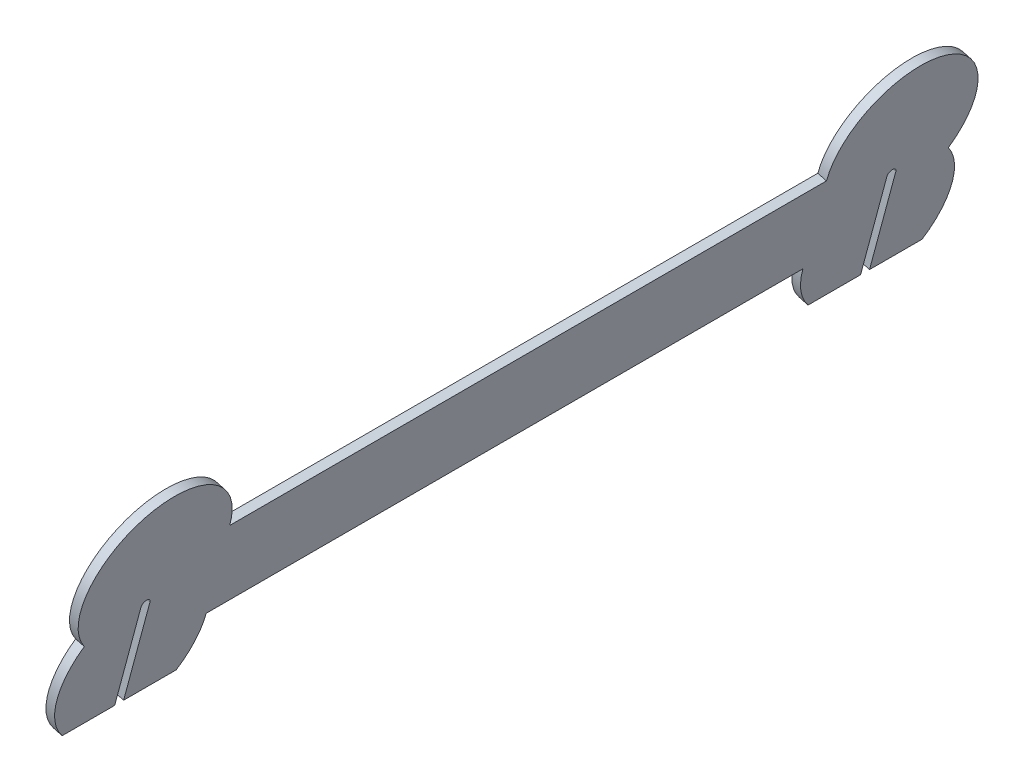
ISO-10303-21;
HEADER;
FILE_DESCRIPTION(('STEP AP214'),'2;1');
FILE_NAME('part.step','',(''),(''),'','','');
FILE_SCHEMA(('AUTOMOTIVE_DESIGN { 1 0 10303 214 1 1 1 1 }'));
ENDSEC;
DATA;
#1=APPLICATION_CONTEXT('core data for automotive mechanical design processes');
#2=APPLICATION_PROTOCOL_DEFINITION('international standard','automotive_design',2000,#1);
#3=PRODUCT_CONTEXT('',#1,'mechanical');
#4=PRODUCT('Part','Part','',(#3));
#5=PRODUCT_RELATED_PRODUCT_CATEGORY('part','',(#4));
#6=PRODUCT_DEFINITION_FORMATION('','',#4);
#7=PRODUCT_DEFINITION_CONTEXT('part definition',#1,'design');
#8=PRODUCT_DEFINITION('design','',#6,#7);
#9=PRODUCT_DEFINITION_SHAPE('','',#8);
#10=(LENGTH_UNIT() NAMED_UNIT(*) SI_UNIT(.MILLI.,.METRE.));
#11=(NAMED_UNIT(*) PLANE_ANGLE_UNIT() SI_UNIT($,.RADIAN.));
#12=(NAMED_UNIT(*) SI_UNIT($,.STERADIAN.) SOLID_ANGLE_UNIT());
#13=UNCERTAINTY_MEASURE_WITH_UNIT(LENGTH_MEASURE(1.E-05),#10,'distance_accuracy_value','');
#14=(GEOMETRIC_REPRESENTATION_CONTEXT(3) GLOBAL_UNCERTAINTY_ASSIGNED_CONTEXT((#13)) GLOBAL_UNIT_ASSIGNED_CONTEXT((#10,
#11,#12)) REPRESENTATION_CONTEXT('',''));
#15=CARTESIAN_POINT('',(0.,0.,0.));
#16=DIRECTION('',(0.,0.,1.));
#17=DIRECTION('',(1.,0.,0.));
#18=AXIS2_PLACEMENT_3D('',#15,#16,#17);
#19=CARTESIAN_POINT('',(228.742174996405,-29.9263928840077,41.2175666415332));
#20=DIRECTION('',(0.258819045102522,0.965925826289068,0.));
#21=DIRECTION('',(-0.965925826289068,0.258819045102523,0.));
#22=AXIS2_PLACEMENT_3D('',#19,#20,#21);
#23=PLANE('',#22);
#24=DIRECTION('',(0.965925826289068,-0.258819045102523,0.));
#25=VECTOR('',#24,1.);
#26=CARTESIAN_POINT('',(228.742174996405,-29.9263928840077,0.));
#27=LINE('',#26,#25);
#28=CARTESIAN_POINT('',(222.94662003867,-28.3734786133926,0.));
#29=VERTEX_POINT('',#28);
#30=CARTESIAN_POINT('',(228.742174996405,-29.9263928840077,0.));
#31=VERTEX_POINT('',#30);
#32=EDGE_CURVE('E155',#29,#31,#27,.T.);
#33=ORIENTED_EDGE('',*,*,#32,.F.);
#34=DIRECTION('',(0.,0.,-1.));
#35=VECTOR('',#34,1.);
#36=CARTESIAN_POINT('',(222.94662003867,-28.3734786133926,41.2175666415332));
#37=LINE('',#36,#35);
#38=CARTESIAN_POINT('',(222.94662003867,-28.3734786133926,-35.2175666415334));
#39=VERTEX_POINT('',#38);
#40=EDGE_CURVE('E72',#29,#39,#37,.T.);
#41=ORIENTED_EDGE('',*,*,#40,.T.);
#42=DIRECTION('',(-0.965925826289068,0.258819045102522,0.));
#43=VECTOR('',#42,1.);
#44=CARTESIAN_POINT('',(228.742174996405,-29.9263928840077,-35.2175666415334));
#45=LINE('',#44,#43);
#46=CARTESIAN_POINT('',(228.742174996405,-29.9263928840077,-35.2175666415334));
#47=VERTEX_POINT('',#46);
#48=EDGE_CURVE('E115',#47,#39,#45,.T.);
#49=ORIENTED_EDGE('',*,*,#48,.F.);
#50=DIRECTION('',(0.,0.,-1.));
#51=VECTOR('',#50,1.);
#52=CARTESIAN_POINT('',(228.742174996405,-29.9263928840077,41.2175666415332));
#53=LINE('',#52,#51);
#54=EDGE_CURVE('E104',#31,#47,#53,.T.);
#55=ORIENTED_EDGE('',*,*,#54,.F.);
#56=EDGE_LOOP('',(#33,#41,#49,#55));
#57=FACE_BOUND('',#56,.T.);
#58=ADVANCED_FACE('F34',(#57),#23,.F.);
#59=CARTESIAN_POINT('',(252.874462761764,60.1365311591842,-246.999999999119));
#60=DIRECTION('',(-0.258819045102522,-0.965925826289068,0.));
#61=DIRECTION('',(0.965925826289068,-0.258819045102523,0.));
#62=AXIS2_PLACEMENT_3D('',#59,#60,#61);
#63=PLANE('',#62);
#64=DIRECTION('',(0.,0.,1.));
#65=VECTOR('',#64,1.);
#66=CARTESIAN_POINT('',(247.078907804029,61.6894454297993,-246.999999999119));
#67=LINE('',#66,#65);
#68=CARTESIAN_POINT('',(247.078907804029,61.6894454297995,-446.999999998238));
#69=VERTEX_POINT('',#68);
#70=CARTESIAN_POINT('',(247.078907804029,61.6894454297993,-47.));
#71=VERTEX_POINT('',#70);
#72=EDGE_CURVE('E128',#69,#71,#67,.T.);
#73=ORIENTED_EDGE('',*,*,#72,.T.);
#74=DIRECTION('',(-0.965925826289068,0.258819045102522,0.));
#75=VECTOR('',#74,1.);
#76=CARTESIAN_POINT('',(252.874462761764,60.1365311591841,-47.));
#77=LINE('',#76,#75);
#78=CARTESIAN_POINT('',(252.874462761764,60.1365311591841,-47.));
#79=VERTEX_POINT('',#78);
#80=EDGE_CURVE('E145',#79,#71,#77,.T.);
#81=ORIENTED_EDGE('',*,*,#80,.F.);
#82=DIRECTION('',(0.,0.,1.));
#83=VECTOR('',#82,1.);
#84=CARTESIAN_POINT('',(252.874462761764,60.1365311591842,-246.999999999119));
#85=LINE('',#84,#83);
#86=CARTESIAN_POINT('',(252.874462761764,60.1365311591843,-446.999999998238));
#87=VERTEX_POINT('',#86);
#88=EDGE_CURVE('E141',#87,#79,#85,.T.);
#89=ORIENTED_EDGE('',*,*,#88,.F.);
#90=DIRECTION('',(-0.965925826289068,0.258819045102522,0.));
#91=VECTOR('',#90,1.);
#92=CARTESIAN_POINT('',(252.874462761764,60.1365311591843,-446.999999998238));
#93=LINE('',#92,#91);
#94=EDGE_CURVE('E205',#87,#69,#93,.T.);
#95=ORIENTED_EDGE('',*,*,#94,.T.);
#96=EDGE_LOOP('',(#73,#81,#89,#95));
#97=FACE_BOUND('',#96,.T.);
#98=ADVANCED_FACE('F36',(#97),#63,.F.);
#99=CARTESIAN_POINT('',(252.874462761764,60.1365311591848,3.));
#100=DIRECTION('',(-0.965925826289068,0.258819045102522,0.));
#101=DIRECTION('',(-0.258819045102523,-0.965925826289068,0.));
#102=AXIS2_PLACEMENT_3D('',#99,#100,#101);
#103=CYLINDRICAL_SURFACE('',#102,50.);
#104=CARTESIAN_POINT('',(247.078907804029,61.6894454298,3.));
#105=DIRECTION('',(0.965925826289068,-0.258819045102522,0.));
#106=DIRECTION('',(0.258819045102522,0.965925826289068,0.));
#107=AXIS2_PLACEMENT_3D('',#104,#105,#106);
#108=CIRCLE('',#107,50.);
#109=CARTESIAN_POINT('',(239.184926928402,32.2287077279829,42.6200706713147));
#110=VERTEX_POINT('',#109);
#111=EDGE_CURVE('E131',#71,#110,#108,.T.);
#112=ORIENTED_EDGE('',*,*,#111,.T.);
#113=DIRECTION('',(-0.965925826289068,0.258819045102522,0.));
#114=VECTOR('',#113,1.);
#115=CARTESIAN_POINT('',(244.980481886137,30.6757934573678,42.6200706713147));
#116=LINE('',#115,#114);
#117=CARTESIAN_POINT('',(244.980481886137,30.6757934573678,42.6200706713147));
#118=VERTEX_POINT('',#117);
#119=EDGE_CURVE('E114',#118,#110,#116,.T.);
#120=ORIENTED_EDGE('',*,*,#119,.F.);
#121=CARTESIAN_POINT('',(252.874462761764,60.1365311591848,3.));
#122=DIRECTION('',(0.965925826289068,-0.258819045102522,0.));
#123=DIRECTION('',(0.258819045102522,0.965925826289068,0.));
#124=AXIS2_PLACEMENT_3D('',#121,#122,#123);
#125=CIRCLE('',#124,50.);
#126=EDGE_CURVE('E87',#79,#118,#125,.T.);
#127=ORIENTED_EDGE('',*,*,#126,.F.);
#128=ORIENTED_EDGE('',*,*,#80,.T.);
#129=EDGE_LOOP('',(#112,#120,#127,#128));
#130=FACE_BOUND('',#129,.T.);
#131=ADVANCED_FACE('F236',(#130),#103,.T.);
#132=CARTESIAN_POINT('',(237.08650101051,1.21505575555107,2.99999999999972));
#133=DIRECTION('',(-0.965925826289068,0.258819045102522,0.));
#134=DIRECTION('',(-0.258819045102523,-0.965925826289068,0.));
#135=AXIS2_PLACEMENT_3D('',#132,#133,#134);
#136=CYLINDRICAL_SURFACE('',#135,50.);
#137=CARTESIAN_POINT('',(231.290946052775,2.76797002616621,2.99999999999972));
#138=DIRECTION('',(0.965925826289068,-0.258819045102522,0.));
#139=DIRECTION('',(0.258819045102522,0.965925826289068,0.));
#140=AXIS2_PLACEMENT_3D('',#137,#138,#139);
#141=CIRCLE('',#140,50.);
#142=CARTESIAN_POINT('',(222.94662003867,-28.3734786133926,41.2175666415332));
#143=VERTEX_POINT('',#142);
#144=EDGE_CURVE('E110',#110,#143,#141,.T.);
#145=ORIENTED_EDGE('',*,*,#144,.T.);
#146=DIRECTION('',(-0.965925826289068,0.258819045102522,0.));
#147=VECTOR('',#146,1.);
#148=CARTESIAN_POINT('',(228.742174996405,-29.9263928840077,41.2175666415332));
#149=LINE('',#148,#147);
#150=CARTESIAN_POINT('',(228.742174996405,-29.9263928840077,41.2175666415332));
#151=VERTEX_POINT('',#150);
#152=EDGE_CURVE('E107',#151,#143,#149,.T.);
#153=ORIENTED_EDGE('',*,*,#152,.F.);
#154=CARTESIAN_POINT('',(237.08650101051,1.21505575555107,2.99999999999972));
#155=DIRECTION('',(0.965925826289068,-0.258819045102522,0.));
#156=DIRECTION('',(0.258819045102522,0.965925826289068,0.));
#157=AXIS2_PLACEMENT_3D('',#154,#155,#156);
#158=CIRCLE('',#157,50.);
#159=EDGE_CURVE('E95',#118,#151,#158,.T.);
#160=ORIENTED_EDGE('',*,*,#159,.F.);
#161=ORIENTED_EDGE('',*,*,#119,.T.);
#162=EDGE_LOOP('',(#145,#153,#160,#161));
#163=FACE_BOUND('',#162,.T.);
#164=ADVANCED_FACE('F108',(#163),#136,.T.);
#165=CARTESIAN_POINT('',(222.94662003867,-28.3734786133926,6.));
#166=VERTEX_POINT('',#165);
#167=EDGE_CURVE('E135',#143,#166,#37,.T.);
#168=ORIENTED_EDGE('',*,*,#167,.T.);
#169=DIRECTION('',(0.965925826289068,-0.258819045102523,0.));
#170=VECTOR('',#169,1.);
#171=CARTESIAN_POINT('',(228.742174996405,-29.9263928840077,6.));
#172=LINE('',#171,#170);
#173=CARTESIAN_POINT('',(228.742174996405,-29.9263928840077,6.));
#174=VERTEX_POINT('',#173);
#175=EDGE_CURVE('E120',#166,#174,#172,.T.);
#176=ORIENTED_EDGE('',*,*,#175,.T.);
#177=EDGE_CURVE('E101',#151,#174,#53,.T.);
#178=ORIENTED_EDGE('',*,*,#177,.F.);
#179=ORIENTED_EDGE('',*,*,#152,.T.);
#180=EDGE_LOOP('',(#168,#176,#178,#179));
#181=FACE_BOUND('',#180,.T.);
#182=ADVANCED_FACE('F118',(#181),#23,.F.);
#183=CARTESIAN_POINT('',(237.08650101051,1.21505575555107,2.99999999999972));
#184=DIRECTION('',(-0.965925826289068,0.258819045102522,0.));
#185=DIRECTION('',(-0.258819045102523,-0.965925826289068,0.));
#186=AXIS2_PLACEMENT_3D('',#183,#184,#185);
#187=CYLINDRICAL_SURFACE('',#186,49.9999999999997);
#188=CARTESIAN_POINT('',(231.290946052775,2.76797002616621,2.99999999999972));
#189=DIRECTION('',(0.965925826289068,-0.258819045102522,0.));
#190=DIRECTION('',(0.258819045102522,0.965925826289068,0.));
#191=AXIS2_PLACEMENT_3D('',#188,#189,#190);
#192=CIRCLE('',#191,49.9999999999997);
#193=CARTESIAN_POINT('',(231.290946052775,2.76797002616696,-47.));
#194=VERTEX_POINT('',#193);
#195=EDGE_CURVE('E78',#39,#194,#192,.T.);
#196=ORIENTED_EDGE('',*,*,#195,.T.);
#197=DIRECTION('',(-0.965925826289068,0.258819045102522,0.));
#198=VECTOR('',#197,1.);
#199=CARTESIAN_POINT('',(237.08650101051,1.21505575555182,-47.));
#200=LINE('',#199,#198);
#201=CARTESIAN_POINT('',(237.08650101051,1.21505575555182,-47.));
#202=VERTEX_POINT('',#201);
#203=EDGE_CURVE('E127',#202,#194,#200,.T.);
#204=ORIENTED_EDGE('',*,*,#203,.F.);
#205=CARTESIAN_POINT('',(237.08650101051,1.21505575555107,2.99999999999972));
#206=DIRECTION('',(0.965925826289068,-0.258819045102522,0.));
#207=DIRECTION('',(0.258819045102522,0.965925826289068,0.));
#208=AXIS2_PLACEMENT_3D('',#205,#206,#207);
#209=CIRCLE('',#208,49.9999999999997);
#210=EDGE_CURVE('E51',#47,#202,#209,.T.);
#211=ORIENTED_EDGE('',*,*,#210,.F.);
#212=ORIENTED_EDGE('',*,*,#48,.T.);
#213=EDGE_LOOP('',(#196,#204,#211,#212));
#214=FACE_BOUND('',#213,.T.);
#215=ADVANCED_FACE('F366',(#214),#187,.T.);
#216=CARTESIAN_POINT('',(237.08650101051,1.21505575555182,-47.));
#217=DIRECTION('',(0.258819045102522,0.965925826289068,0.));
#218=DIRECTION('',(-0.965925826289068,0.258819045102523,0.));
#219=AXIS2_PLACEMENT_3D('',#216,#217,#218);
#220=PLANE('',#219);
#221=DIRECTION('',(0.,0.,-1.));
#222=VECTOR('',#221,1.);
#223=CARTESIAN_POINT('',(231.290946052775,2.76797002616696,-47.));
#224=LINE('',#223,#222);
#225=CARTESIAN_POINT('',(231.290946052775,2.76797002616714,-446.999999998239));
#226=VERTEX_POINT('',#225);
#227=EDGE_CURVE('E138',#194,#226,#224,.T.);
#228=ORIENTED_EDGE('',*,*,#227,.T.);
#229=DIRECTION('',(-0.965925826289068,0.258819045102522,0.));
#230=VECTOR('',#229,1.);
#231=CARTESIAN_POINT('',(237.08650101051,1.215055755552,-446.999999998239));
#232=LINE('',#231,#230);
#233=CARTESIAN_POINT('',(237.08650101051,1.215055755552,-446.999999998239));
#234=VERTEX_POINT('',#233);
#235=EDGE_CURVE('E180',#234,#226,#232,.T.);
#236=ORIENTED_EDGE('',*,*,#235,.F.);
#237=DIRECTION('',(0.,0.,-1.));
#238=VECTOR('',#237,1.);
#239=CARTESIAN_POINT('',(237.08650101051,1.21505575555182,-47.));
#240=LINE('',#239,#238);
#241=EDGE_CURVE('E122',#202,#234,#240,.T.);
#242=ORIENTED_EDGE('',*,*,#241,.F.);
#243=ORIENTED_EDGE('',*,*,#203,.T.);
#244=EDGE_LOOP('',(#228,#236,#242,#243));
#245=FACE_BOUND('',#244,.T.);
#246=ADVANCED_FACE('F177',(#245),#220,.F.);
#247=CARTESIAN_POINT('',(252.874462761764,60.1365311591848,3.));
#248=DIRECTION('',(0.965925826289068,-0.258819045102522,0.));
#249=DIRECTION('',(0.258819045102522,0.965925826289068,0.));
#250=AXIS2_PLACEMENT_3D('',#247,#248,#249);
#251=PLANE('',#250);
#252=CARTESIAN_POINT('',(246.403986634201,35.9883855019581,3.));
#253=DIRECTION('',(0.965925826289068,-0.258819045102523,0.));
#254=DIRECTION('',(0.258819045102523,0.965925826289068,0.));
#255=AXIS2_PLACEMENT_3D('',#252,#253,#254);
#256=CIRCLE('',#255,3.);
#257=CARTESIAN_POINT('',(246.403986634201,35.9883855019581,0.));
#258=VERTEX_POINT('',#257);
#259=CARTESIAN_POINT('',(246.403986634201,35.988385501958,6.));
#260=VERTEX_POINT('',#259);
#261=EDGE_CURVE('E214',#258,#260,#256,.T.);
#262=ORIENTED_EDGE('',*,*,#261,.F.);
#263=DIRECTION('',(-0.258819045102522,-0.965925826289068,0.));
#264=VECTOR('',#263,1.);
#265=CARTESIAN_POINT('',(252.874462761764,60.1365311591848,0.));
#266=LINE('',#265,#264);
#267=EDGE_CURVE('E164',#258,#31,#266,.T.);
#268=ORIENTED_EDGE('',*,*,#267,.T.);
#269=ORIENTED_EDGE('',*,*,#54,.T.);
#270=ORIENTED_EDGE('',*,*,#210,.T.);
#271=ORIENTED_EDGE('',*,*,#241,.T.);
#272=CARTESIAN_POINT('',(237.08650101051,1.21505575555129,-496.999999998238));
#273=DIRECTION('',(-0.965925826289068,0.258819045102522,0.));
#274=DIRECTION('',(0.258819045102522,0.965925826289068,0.));
#275=AXIS2_PLACEMENT_3D('',#272,#273,#274);
#276=CIRCLE('',#275,49.9999999999997);
#277=CARTESIAN_POINT('',(228.742174996405,-29.9263928840075,-458.782433356705));
#278=VERTEX_POINT('',#277);
#279=EDGE_CURVE('E189',#278,#234,#276,.T.);
#280=ORIENTED_EDGE('',*,*,#279,.F.);
#281=DIRECTION('',(0.,0.,1.));
#282=VECTOR('',#281,1.);
#283=CARTESIAN_POINT('',(228.742174996405,-29.9263928840075,-535.217566639772));
#284=LINE('',#283,#282);
#285=CARTESIAN_POINT('',(228.742174996405,-29.9263928840075,-493.999999998239));
#286=VERTEX_POINT('',#285);
#287=EDGE_CURVE('E306',#286,#278,#284,.T.);
#288=ORIENTED_EDGE('',*,*,#287,.F.);
#289=DIRECTION('',(-0.258819045102522,-0.965925826289068,0.));
#290=VECTOR('',#289,1.);
#291=CARTESIAN_POINT('',(252.874462761764,60.1365311591851,-493.999999998238));
#292=LINE('',#291,#290);
#293=CARTESIAN_POINT('',(246.403986634201,35.9883855019583,-493.999999998238));
#294=VERTEX_POINT('',#293);
#295=EDGE_CURVE('E294',#294,#286,#292,.T.);
#296=ORIENTED_EDGE('',*,*,#295,.F.);
#297=CARTESIAN_POINT('',(246.403986634201,35.9883855019583,-496.999999998238));
#298=DIRECTION('',(-0.965925826289068,0.258819045102523,0.));
#299=DIRECTION('',(0.258819045102523,0.965925826289068,0.));
#300=AXIS2_PLACEMENT_3D('',#297,#298,#299);
#301=CIRCLE('',#300,3.);
#302=CARTESIAN_POINT('',(246.403986634201,35.9883855019583,-499.999999998238));
#303=VERTEX_POINT('',#302);
#304=EDGE_CURVE('E304',#294,#303,#301,.T.);
#305=ORIENTED_EDGE('',*,*,#304,.T.);
#306=DIRECTION('',(-0.258819045102522,-0.965925826289068,0.));
#307=VECTOR('',#306,1.);
#308=CARTESIAN_POINT('',(252.874462761764,60.1365311591851,-499.999999998238));
#309=LINE('',#308,#307);
#310=CARTESIAN_POINT('',(228.742174996405,-29.9263928840075,-499.999999998239));
#311=VERTEX_POINT('',#310);
#312=EDGE_CURVE('E320',#303,#311,#309,.T.);
#313=ORIENTED_EDGE('',*,*,#312,.T.);
#314=CARTESIAN_POINT('',(228.742174996405,-29.9263928840075,-535.217566639772));
#315=VERTEX_POINT('',#314);
#316=EDGE_CURVE('E195',#315,#311,#284,.T.);
#317=ORIENTED_EDGE('',*,*,#316,.F.);
#318=CARTESIAN_POINT('',(237.08650101051,1.21505575555129,-496.999999998238));
#319=DIRECTION('',(-0.965925826289068,0.258819045102522,0.));
#320=DIRECTION('',(0.258819045102522,0.965925826289068,0.));
#321=AXIS2_PLACEMENT_3D('',#318,#319,#320);
#322=CIRCLE('',#321,50.);
#323=CARTESIAN_POINT('',(244.980481886137,30.6757934573681,-536.620070669553));
#324=VERTEX_POINT('',#323);
#325=EDGE_CURVE('E324',#324,#315,#322,.T.);
#326=ORIENTED_EDGE('',*,*,#325,.F.);
#327=CARTESIAN_POINT('',(252.874462761764,60.1365311591851,-496.999999998238));
#328=DIRECTION('',(-0.965925826289068,0.258819045102522,0.));
#329=DIRECTION('',(0.258819045102522,0.965925826289068,0.));
#330=AXIS2_PLACEMENT_3D('',#327,#328,#329);
#331=CIRCLE('',#330,50.);
#332=EDGE_CURVE('E232',#87,#324,#331,.T.);
#333=ORIENTED_EDGE('',*,*,#332,.F.);
#334=ORIENTED_EDGE('',*,*,#88,.T.);
#335=ORIENTED_EDGE('',*,*,#126,.T.);
#336=ORIENTED_EDGE('',*,*,#159,.T.);
#337=ORIENTED_EDGE('',*,*,#177,.T.);
#338=DIRECTION('',(-0.258819045102522,-0.965925826289068,0.));
#339=VECTOR('',#338,1.);
#340=CARTESIAN_POINT('',(252.874462761764,60.1365311591848,6.));
#341=LINE('',#340,#339);
#342=EDGE_CURVE('E132',#260,#174,#341,.T.);
#343=ORIENTED_EDGE('',*,*,#342,.F.);
#344=EDGE_LOOP('',(#262,#268,#269,#270,#271,#280,#288,#296,#305,#313,#317,#326,#333,#334,#335,
#336,#337,#343));
#345=FACE_BOUND('',#344,.T.);
#346=ADVANCED_FACE('F98',(#345),#251,.T.);
#347=CARTESIAN_POINT('',(247.078907804029,61.6894454298,3.));
#348=DIRECTION('',(0.965925826289068,-0.258819045102522,0.));
#349=DIRECTION('',(0.258819045102522,0.965925826289068,0.));
#350=AXIS2_PLACEMENT_3D('',#347,#348,#349);
#351=PLANE('',#350);
#352=DIRECTION('',(-0.258819045102522,-0.965925826289068,0.));
#353=VECTOR('',#352,1.);
#354=CARTESIAN_POINT('',(247.078907804029,61.6894454298,0.));
#355=LINE('',#354,#353);
#356=CARTESIAN_POINT('',(240.608431676466,37.5412997725732,0.));
#357=VERTEX_POINT('',#356);
#358=EDGE_CURVE('E43',#357,#29,#355,.T.);
#359=ORIENTED_EDGE('',*,*,#358,.F.);
#360=CARTESIAN_POINT('',(240.608431676466,37.5412997725732,3.));
#361=DIRECTION('',(0.965925826289068,-0.258819045102522,0.));
#362=DIRECTION('',(0.258819045102522,0.965925826289068,0.));
#363=AXIS2_PLACEMENT_3D('',#360,#361,#362);
#364=CIRCLE('',#363,3.);
#365=CARTESIAN_POINT('',(240.608431676466,37.5412997725733,6.));
#366=VERTEX_POINT('',#365);
#367=EDGE_CURVE('E165',#357,#366,#364,.T.);
#368=ORIENTED_EDGE('',*,*,#367,.T.);
#369=DIRECTION('',(-0.258819045102522,-0.965925826289068,0.));
#370=VECTOR('',#369,1.);
#371=CARTESIAN_POINT('',(247.078907804029,61.6894454298,6.));
#372=LINE('',#371,#370);
#373=EDGE_CURVE('E11',#366,#166,#372,.T.);
#374=ORIENTED_EDGE('',*,*,#373,.T.);
#375=ORIENTED_EDGE('',*,*,#167,.F.);
#376=ORIENTED_EDGE('',*,*,#144,.F.);
#377=ORIENTED_EDGE('',*,*,#111,.F.);
#378=ORIENTED_EDGE('',*,*,#72,.F.);
#379=CARTESIAN_POINT('',(247.078907804029,61.6894454298002,-496.999999998238));
#380=DIRECTION('',(-0.965925826289068,0.258819045102522,0.));
#381=DIRECTION('',(0.258819045102522,0.965925826289068,0.));
#382=AXIS2_PLACEMENT_3D('',#379,#380,#381);
#383=CIRCLE('',#382,50.);
#384=CARTESIAN_POINT('',(239.184926928402,32.2287077279832,-536.620070669553));
#385=VERTEX_POINT('',#384);
#386=EDGE_CURVE('E322',#69,#385,#383,.T.);
#387=ORIENTED_EDGE('',*,*,#386,.T.);
#388=CARTESIAN_POINT('',(231.290946052775,2.76797002616643,-496.999999998238));
#389=DIRECTION('',(-0.965925826289068,0.258819045102522,0.));
#390=DIRECTION('',(0.258819045102522,0.965925826289068,0.));
#391=AXIS2_PLACEMENT_3D('',#388,#389,#390);
#392=CIRCLE('',#391,50.);
#393=CARTESIAN_POINT('',(222.94662003867,-28.3734786133923,-535.217566639772));
#394=VERTEX_POINT('',#393);
#395=EDGE_CURVE('E331',#385,#394,#392,.T.);
#396=ORIENTED_EDGE('',*,*,#395,.T.);
#397=DIRECTION('',(0.,0.,1.));
#398=VECTOR('',#397,1.);
#399=CARTESIAN_POINT('',(222.94662003867,-28.3734786133923,-535.217566639772));
#400=LINE('',#399,#398);
#401=CARTESIAN_POINT('',(222.94662003867,-28.3734786133924,-499.999999998239));
#402=VERTEX_POINT('',#401);
#403=EDGE_CURVE('E334',#394,#402,#400,.T.);
#404=ORIENTED_EDGE('',*,*,#403,.T.);
#405=DIRECTION('',(-0.258819045102522,-0.965925826289068,0.));
#406=VECTOR('',#405,1.);
#407=CARTESIAN_POINT('',(247.078907804029,61.6894454298002,-499.999999998238));
#408=LINE('',#407,#406);
#409=CARTESIAN_POINT('',(240.608431676466,37.5412997725735,-499.999999998238));
#410=VERTEX_POINT('',#409);
#411=EDGE_CURVE('E211',#410,#402,#408,.T.);
#412=ORIENTED_EDGE('',*,*,#411,.F.);
#413=CARTESIAN_POINT('',(240.608431676466,37.5412997725735,-496.999999998238));
#414=DIRECTION('',(-0.965925826289068,0.258819045102522,0.));
#415=DIRECTION('',(0.258819045102522,0.965925826289068,0.));
#416=AXIS2_PLACEMENT_3D('',#413,#414,#415);
#417=CIRCLE('',#416,3.);
#418=CARTESIAN_POINT('',(240.608431676466,37.5412997725735,-493.999999998238));
#419=VERTEX_POINT('',#418);
#420=EDGE_CURVE('E300',#419,#410,#417,.T.);
#421=ORIENTED_EDGE('',*,*,#420,.F.);
#422=DIRECTION('',(-0.258819045102522,-0.965925826289068,0.));
#423=VECTOR('',#422,1.);
#424=CARTESIAN_POINT('',(247.078907804029,61.6894454298002,-493.999999998238));
#425=LINE('',#424,#423);
#426=CARTESIAN_POINT('',(222.94662003867,-28.3734786133924,-493.999999998239));
#427=VERTEX_POINT('',#426);
#428=EDGE_CURVE('E208',#419,#427,#425,.T.);
#429=ORIENTED_EDGE('',*,*,#428,.T.);
#430=CARTESIAN_POINT('',(222.94662003867,-28.3734786133924,-458.782433356705));
#431=VERTEX_POINT('',#430);
#432=EDGE_CURVE('E333',#427,#431,#400,.T.);
#433=ORIENTED_EDGE('',*,*,#432,.T.);
#434=CARTESIAN_POINT('',(231.290946052775,2.76797002616643,-496.999999998238));
#435=DIRECTION('',(-0.965925826289068,0.258819045102522,0.));
#436=DIRECTION('',(0.258819045102522,0.965925826289068,0.));
#437=AXIS2_PLACEMENT_3D('',#434,#435,#436);
#438=CIRCLE('',#437,49.9999999999997);
#439=EDGE_CURVE('E173',#431,#226,#438,.T.);
#440=ORIENTED_EDGE('',*,*,#439,.T.);
#441=ORIENTED_EDGE('',*,*,#227,.F.);
#442=ORIENTED_EDGE('',*,*,#195,.F.);
#443=ORIENTED_EDGE('',*,*,#40,.F.);
#444=EDGE_LOOP('',(#359,#368,#374,#375,#376,#377,#378,#387,#396,#404,#412,#421,#429,#433,#440,
#441,#442,#443));
#445=FACE_BOUND('',#444,.T.);
#446=ADVANCED_FACE('F167',(#445),#351,.F.);
#447=CARTESIAN_POINT('',(249.999999999119,0.,6.));
#448=DIRECTION('',(0.,0.,1.));
#449=DIRECTION('',(1.,0.,0.));
#450=AXIS2_PLACEMENT_3D('',#447,#448,#449);
#451=PLANE('',#450);
#452=ORIENTED_EDGE('',*,*,#175,.F.);
#453=ORIENTED_EDGE('',*,*,#373,.F.);
#454=DIRECTION('',(0.965925826289068,-0.258819045102523,0.));
#455=VECTOR('',#454,1.);
#456=CARTESIAN_POINT('',(206.018627837055,46.8096097776946,6.));
#457=LINE('',#456,#455);
#458=EDGE_CURVE('E217',#366,#260,#457,.T.);
#459=ORIENTED_EDGE('',*,*,#458,.T.);
#460=ORIENTED_EDGE('',*,*,#342,.T.);
#461=EDGE_LOOP('',(#452,#453,#459,#460));
#462=FACE_BOUND('',#461,.T.);
#463=ADVANCED_FACE('F413',(#462),#451,.F.);
#464=CARTESIAN_POINT('',(249.999999999119,0.,0.));
#465=DIRECTION('',(0.,0.,1.));
#466=DIRECTION('',(1.,0.,0.));
#467=AXIS2_PLACEMENT_3D('',#464,#465,#466);
#468=PLANE('',#467);
#469=ORIENTED_EDGE('',*,*,#32,.T.);
#470=ORIENTED_EDGE('',*,*,#267,.F.);
#471=DIRECTION('',(0.965925826289068,-0.258819045102523,0.));
#472=VECTOR('',#471,1.);
#473=CARTESIAN_POINT('',(206.018627837055,46.8096097776946,0.));
#474=LINE('',#473,#472);
#475=EDGE_CURVE('E159',#357,#258,#474,.T.);
#476=ORIENTED_EDGE('',*,*,#475,.F.);
#477=ORIENTED_EDGE('',*,*,#358,.T.);
#478=EDGE_LOOP('',(#469,#470,#476,#477));
#479=FACE_BOUND('',#478,.T.);
#480=ADVANCED_FACE('F152',(#479),#468,.T.);
#481=CARTESIAN_POINT('',(206.018627837055,46.8096097776946,3.));
#482=DIRECTION('',(0.965925826289068,-0.258819045102523,0.));
#483=DIRECTION('',(0.258819045102523,0.965925826289068,0.));
#484=AXIS2_PLACEMENT_3D('',#481,#482,#483);
#485=CYLINDRICAL_SURFACE('',#484,3.);
#486=ORIENTED_EDGE('',*,*,#475,.T.);
#487=ORIENTED_EDGE('',*,*,#261,.T.);
#488=ORIENTED_EDGE('',*,*,#458,.F.);
#489=ORIENTED_EDGE('',*,*,#367,.F.);
#490=EDGE_LOOP('',(#486,#487,#488,#489));
#491=FACE_BOUND('',#490,.T.);
#492=ADVANCED_FACE('F342',(#491),#485,.F.);
#493=CARTESIAN_POINT('',(228.742174996405,-29.9263928840075,-535.217566639772));
#494=DIRECTION('',(0.258819045102522,0.965925826289068,0.));
#495=DIRECTION('',(-0.965925826289068,0.258819045102523,0.));
#496=AXIS2_PLACEMENT_3D('',#493,#494,#495);
#497=PLANE('',#496);
#498=DIRECTION('',(0.965925826289068,-0.258819045102523,0.));
#499=VECTOR('',#498,1.);
#500=CARTESIAN_POINT('',(228.742174996405,-29.9263928840075,-493.999999998239));
#501=LINE('',#500,#499);
#502=EDGE_CURVE('E309',#427,#286,#501,.T.);
#503=ORIENTED_EDGE('',*,*,#502,.T.);
#504=ORIENTED_EDGE('',*,*,#287,.T.);
#505=DIRECTION('',(-0.965925826289068,0.258819045102522,0.));
#506=VECTOR('',#505,1.);
#507=CARTESIAN_POINT('',(228.742174996405,-29.9263928840075,-458.782433356705));
#508=LINE('',#507,#506);
#509=EDGE_CURVE('E190',#278,#431,#508,.T.);
#510=ORIENTED_EDGE('',*,*,#509,.T.);
#511=ORIENTED_EDGE('',*,*,#432,.F.);
#512=EDGE_LOOP('',(#503,#504,#510,#511));
#513=FACE_BOUND('',#512,.T.);
#514=ADVANCED_FACE('F339',(#513),#497,.F.);
#515=CARTESIAN_POINT('',(252.874462761764,60.1365311591851,-496.999999998238));
#516=DIRECTION('',(-0.965925826289068,0.258819045102522,0.));
#517=DIRECTION('',(-0.258819045102523,-0.965925826289068,0.));
#518=AXIS2_PLACEMENT_3D('',#515,#516,#517);
#519=CYLINDRICAL_SURFACE('',#518,50.);
#520=ORIENTED_EDGE('',*,*,#386,.F.);
#521=ORIENTED_EDGE('',*,*,#94,.F.);
#522=ORIENTED_EDGE('',*,*,#332,.T.);
#523=DIRECTION('',(-0.965925826289068,0.258819045102522,0.));
#524=VECTOR('',#523,1.);
#525=CARTESIAN_POINT('',(244.980481886137,30.6757934573681,-536.620070669553));
#526=LINE('',#525,#524);
#527=EDGE_CURVE('E202',#324,#385,#526,.T.);
#528=ORIENTED_EDGE('',*,*,#527,.T.);
#529=EDGE_LOOP('',(#520,#521,#522,#528));
#530=FACE_BOUND('',#529,.T.);
#531=ADVANCED_FACE('F341',(#530),#519,.T.);
#532=CARTESIAN_POINT('',(237.08650101051,1.21505575555129,-496.999999998238));
#533=DIRECTION('',(-0.965925826289068,0.258819045102522,0.));
#534=DIRECTION('',(-0.258819045102523,-0.965925826289068,0.));
#535=AXIS2_PLACEMENT_3D('',#532,#533,#534);
#536=CYLINDRICAL_SURFACE('',#535,50.);
#537=ORIENTED_EDGE('',*,*,#395,.F.);
#538=ORIENTED_EDGE('',*,*,#527,.F.);
#539=ORIENTED_EDGE('',*,*,#325,.T.);
#540=DIRECTION('',(-0.965925826289068,0.258819045102522,0.));
#541=VECTOR('',#540,1.);
#542=CARTESIAN_POINT('',(228.742174996405,-29.9263928840075,-535.217566639772));
#543=LINE('',#542,#541);
#544=EDGE_CURVE('E193',#315,#394,#543,.T.);
#545=ORIENTED_EDGE('',*,*,#544,.T.);
#546=EDGE_LOOP('',(#537,#538,#539,#545));
#547=FACE_BOUND('',#546,.T.);
#548=ADVANCED_FACE('F349',(#547),#536,.T.);
#549=ORIENTED_EDGE('',*,*,#403,.F.);
#550=ORIENTED_EDGE('',*,*,#544,.F.);
#551=ORIENTED_EDGE('',*,*,#316,.T.);
#552=DIRECTION('',(0.965925826289068,-0.258819045102523,0.));
#553=VECTOR('',#552,1.);
#554=CARTESIAN_POINT('',(228.742174996405,-29.9263928840075,-499.999999998239));
#555=LINE('',#554,#553);
#556=EDGE_CURVE('E308',#402,#311,#555,.T.);
#557=ORIENTED_EDGE('',*,*,#556,.F.);
#558=EDGE_LOOP('',(#549,#550,#551,#557));
#559=FACE_BOUND('',#558,.T.);
#560=ADVANCED_FACE('F344',(#559),#497,.F.);
#561=CARTESIAN_POINT('',(237.08650101051,1.21505575555129,-496.999999998238));
#562=DIRECTION('',(-0.965925826289068,0.258819045102522,0.));
#563=DIRECTION('',(-0.258819045102523,-0.965925826289068,0.));
#564=AXIS2_PLACEMENT_3D('',#561,#562,#563);
#565=CYLINDRICAL_SURFACE('',#564,49.9999999999997);
#566=ORIENTED_EDGE('',*,*,#439,.F.);
#567=ORIENTED_EDGE('',*,*,#509,.F.);
#568=ORIENTED_EDGE('',*,*,#279,.T.);
#569=ORIENTED_EDGE('',*,*,#235,.T.);
#570=EDGE_LOOP('',(#566,#567,#568,#569));
#571=FACE_BOUND('',#570,.T.);
#572=ADVANCED_FACE('F186',(#571),#565,.T.);
#573=CARTESIAN_POINT('',(249.999999999119,2.22389715067941E-13,-499.999999998239));
#574=DIRECTION('',(0.,0.,-1.));
#575=DIRECTION('',(1.,0.,0.));
#576=AXIS2_PLACEMENT_3D('',#573,#574,#575);
#577=PLANE('',#576);
#578=ORIENTED_EDGE('',*,*,#556,.T.);
#579=ORIENTED_EDGE('',*,*,#312,.F.);
#580=DIRECTION('',(0.965925826289068,-0.258819045102523,0.));
#581=VECTOR('',#580,1.);
#582=CARTESIAN_POINT('',(206.018627837055,46.8096097776948,-499.999999998238));
#583=LINE('',#582,#581);
#584=EDGE_CURVE('E301',#410,#303,#583,.T.);
#585=ORIENTED_EDGE('',*,*,#584,.F.);
#586=ORIENTED_EDGE('',*,*,#411,.T.);
#587=EDGE_LOOP('',(#578,#579,#585,#586));
#588=FACE_BOUND('',#587,.T.);
#589=ADVANCED_FACE('F451',(#588),#577,.F.);
#590=CARTESIAN_POINT('',(249.999999999119,2.1711565067896E-13,-493.999999998239));
#591=DIRECTION('',(0.,0.,-1.));
#592=DIRECTION('',(1.,0.,0.));
#593=AXIS2_PLACEMENT_3D('',#590,#591,#592);
#594=PLANE('',#593);
#595=ORIENTED_EDGE('',*,*,#502,.F.);
#596=ORIENTED_EDGE('',*,*,#428,.F.);
#597=DIRECTION('',(0.965925826289068,-0.258819045102523,0.));
#598=VECTOR('',#597,1.);
#599=CARTESIAN_POINT('',(206.018627837055,46.8096097776948,-493.999999998238));
#600=LINE('',#599,#598);
#601=EDGE_CURVE('E290',#419,#294,#600,.T.);
#602=ORIENTED_EDGE('',*,*,#601,.T.);
#603=ORIENTED_EDGE('',*,*,#295,.T.);
#604=EDGE_LOOP('',(#595,#596,#602,#603));
#605=FACE_BOUND('',#604,.T.);
#606=ADVANCED_FACE('F293',(#605),#594,.T.);
#607=CARTESIAN_POINT('',(206.018627837055,46.8096097776948,-496.999999998238));
#608=DIRECTION('',(0.965925826289068,-0.258819045102523,0.));
#609=DIRECTION('',(0.258819045102523,0.965925826289068,0.));
#610=AXIS2_PLACEMENT_3D('',#607,#608,#609);
#611=CYLINDRICAL_SURFACE('',#610,3.);
#612=ORIENTED_EDGE('',*,*,#601,.F.);
#613=ORIENTED_EDGE('',*,*,#420,.T.);
#614=ORIENTED_EDGE('',*,*,#584,.T.);
#615=ORIENTED_EDGE('',*,*,#304,.F.);
#616=EDGE_LOOP('',(#612,#613,#614,#615));
#617=FACE_BOUND('',#616,.T.);
#618=ADVANCED_FACE('F311',(#617),#611,.F.);
#619=CLOSED_SHELL('',(#58,#98,#131,#164,#182,#215,#246,#346,#446,#463,#480,#492,#514,#531,#548,
#560,#572,#589,#606,#618));
#620=MANIFOLD_SOLID_BREP('B2',#619);
#621=ADVANCED_BREP_SHAPE_REPRESENTATION('',(#18,#620),#14);
#622=SHAPE_DEFINITION_REPRESENTATION(#9,#621);
ENDSEC;
END-ISO-10303-21;
